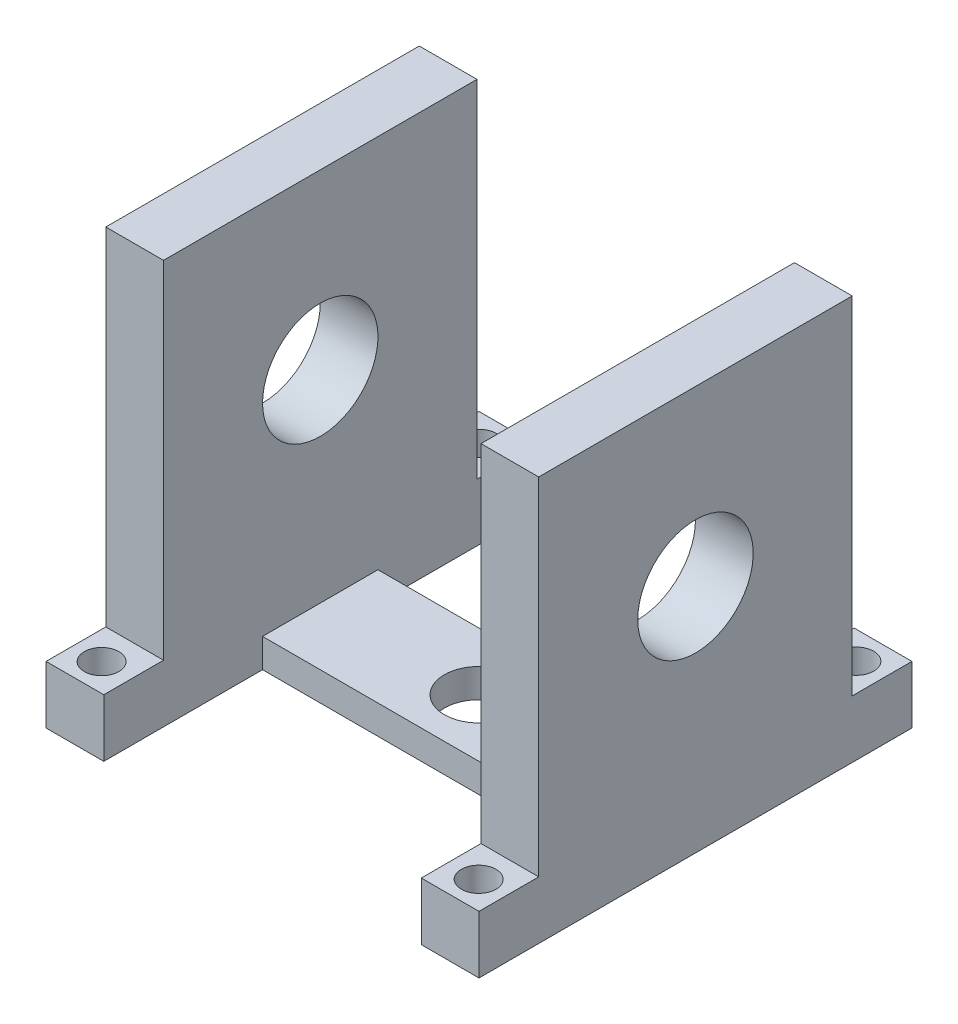
ISO-10303-21;
HEADER;
FILE_DESCRIPTION(('STEP AP214'),'2;1');
FILE_NAME('part.step','',(''),(''),'','','');
FILE_SCHEMA(('AUTOMOTIVE_DESIGN { 1 0 10303 214 1 1 1 1 }'));
ENDSEC;
DATA;
#1=APPLICATION_CONTEXT('core data for automotive mechanical design processes');
#2=APPLICATION_PROTOCOL_DEFINITION('international standard','automotive_design',2000,#1);
#3=PRODUCT_CONTEXT('',#1,'mechanical');
#4=PRODUCT('Part','Part','',(#3));
#5=PRODUCT_RELATED_PRODUCT_CATEGORY('part','',(#4));
#6=PRODUCT_DEFINITION_FORMATION('','',#4);
#7=PRODUCT_DEFINITION_CONTEXT('part definition',#1,'design');
#8=PRODUCT_DEFINITION('design','',#6,#7);
#9=PRODUCT_DEFINITION_SHAPE('','',#8);
#10=(LENGTH_UNIT() NAMED_UNIT(*) SI_UNIT(.MILLI.,.METRE.));
#11=(NAMED_UNIT(*) PLANE_ANGLE_UNIT() SI_UNIT($,.RADIAN.));
#12=(NAMED_UNIT(*) SI_UNIT($,.STERADIAN.) SOLID_ANGLE_UNIT());
#13=UNCERTAINTY_MEASURE_WITH_UNIT(LENGTH_MEASURE(1.E-05),#10,'distance_accuracy_value','');
#14=(GEOMETRIC_REPRESENTATION_CONTEXT(3) GLOBAL_UNCERTAINTY_ASSIGNED_CONTEXT((#13)) GLOBAL_UNIT_ASSIGNED_CONTEXT((#10,
#11,#12)) REPRESENTATION_CONTEXT('',''));
#15=CARTESIAN_POINT('',(0.,0.,0.));
#16=DIRECTION('',(0.,0.,1.));
#17=DIRECTION('',(1.,0.,0.));
#18=AXIS2_PLACEMENT_3D('',#15,#16,#17);
#19=CARTESIAN_POINT('',(0.,10.,0.));
#20=DIRECTION('',(0.,-1.,0.));
#21=DIRECTION('',(0.,0.,-1.));
#22=AXIS2_PLACEMENT_3D('',#19,#20,#21);
#23=PLANE('',#22);
#24=CARTESIAN_POINT('',(32.66,10.,32.72));
#25=DIRECTION('',(0.,1.,0.));
#26=DIRECTION('',(0.,0.,1.));
#27=AXIS2_PLACEMENT_3D('',#24,#25,#26);
#28=CIRCLE('',#27,3.);
#29=CARTESIAN_POINT('',(32.66,10.,35.72));
#30=VERTEX_POINT('',#29);
#31=EDGE_CURVE('E301',#30,#30,#28,.T.);
#32=ORIENTED_EDGE('',*,*,#31,.F.);
#33=EDGE_LOOP('',(#32));
#34=FACE_BOUND('',#33,.T.);
#35=DIRECTION('',(0.,0.,-1.));
#36=VECTOR('',#35,1.);
#37=CARTESIAN_POINT('',(27.4999999999999,10.,0.));
#38=LINE('',#37,#36);
#39=CARTESIAN_POINT('',(27.5,10.,37.5));
#40=VERTEX_POINT('',#39);
#41=CARTESIAN_POINT('',(27.5,10.,27.154127805021));
#42=VERTEX_POINT('',#41);
#43=EDGE_CURVE('E206',#40,#42,#38,.T.);
#44=ORIENTED_EDGE('',*,*,#43,.F.);
#45=DIRECTION('',(1.,0.,0.));
#46=VECTOR('',#45,1.);
#47=CARTESIAN_POINT('',(37.5,10.,37.5));
#48=LINE('',#47,#46);
#49=CARTESIAN_POINT('',(37.5,10.,37.5));
#50=VERTEX_POINT('',#49);
#51=EDGE_CURVE('E321',#40,#50,#48,.T.);
#52=ORIENTED_EDGE('',*,*,#51,.T.);
#53=DIRECTION('',(0.,0.,-1.));
#54=VECTOR('',#53,1.);
#55=CARTESIAN_POINT('',(37.5,10.,-37.5));
#56=LINE('',#55,#54);
#57=CARTESIAN_POINT('',(37.5,10.,27.154127805021));
#58=VERTEX_POINT('',#57);
#59=EDGE_CURVE('E327',#50,#58,#56,.T.);
#60=ORIENTED_EDGE('',*,*,#59,.T.);
#61=DIRECTION('',(1.,0.,0.));
#62=VECTOR('',#61,1.);
#63=CARTESIAN_POINT('',(37.5,10.,27.154127805021));
#64=LINE('',#63,#62);
#65=EDGE_CURVE('E243',#42,#58,#64,.T.);
#66=ORIENTED_EDGE('',*,*,#65,.F.);
#67=EDGE_LOOP('',(#44,#52,#60,#66));
#68=FACE_BOUND('',#67,.T.);
#69=ADVANCED_FACE('F39',(#34,#68),#23,.F.);
#70=CARTESIAN_POINT('',(-32.66,10.,32.72));
#71=DIRECTION('',(0.,1.,0.));
#72=DIRECTION('',(0.,0.,-1.));
#73=AXIS2_PLACEMENT_3D('',#70,#71,#72);
#74=CIRCLE('',#73,3.);
#75=CARTESIAN_POINT('',(-32.66,10.,29.72));
#76=VERTEX_POINT('',#75);
#77=EDGE_CURVE('E295',#76,#76,#74,.T.);
#78=ORIENTED_EDGE('',*,*,#77,.F.);
#79=EDGE_LOOP('',(#78));
#80=FACE_BOUND('',#79,.T.);
#81=CARTESIAN_POINT('',(-37.5,10.,37.5));
#82=VERTEX_POINT('',#81);
#83=CARTESIAN_POINT('',(-27.5,10.,37.5));
#84=VERTEX_POINT('',#83);
#85=EDGE_CURVE('E323',#82,#84,#48,.T.);
#86=ORIENTED_EDGE('',*,*,#85,.T.);
#87=DIRECTION('',(0.,0.,-1.));
#88=VECTOR('',#87,1.);
#89=CARTESIAN_POINT('',(-27.5,10.,0.));
#90=LINE('',#89,#88);
#91=CARTESIAN_POINT('',(-27.5,10.,27.154127805021));
#92=VERTEX_POINT('',#91);
#93=EDGE_CURVE('E63',#84,#92,#90,.T.);
#94=ORIENTED_EDGE('',*,*,#93,.T.);
#95=DIRECTION('',(1.,0.,0.));
#96=VECTOR('',#95,1.);
#97=CARTESIAN_POINT('',(-37.5,10.,27.154127805021));
#98=LINE('',#97,#96);
#99=CARTESIAN_POINT('',(-37.5,10.,27.154127805021));
#100=VERTEX_POINT('',#99);
#101=EDGE_CURVE('E265',#100,#92,#98,.T.);
#102=ORIENTED_EDGE('',*,*,#101,.F.);
#103=DIRECTION('',(0.,0.,1.));
#104=VECTOR('',#103,1.);
#105=CARTESIAN_POINT('',(-37.5,10.,-37.5));
#106=LINE('',#105,#104);
#107=EDGE_CURVE('E322',#100,#82,#106,.T.);
#108=ORIENTED_EDGE('',*,*,#107,.T.);
#109=EDGE_LOOP('',(#86,#94,#102,#108));
#110=FACE_BOUND('',#109,.T.);
#111=ADVANCED_FACE('F432',(#80,#110),#23,.F.);
#112=CARTESIAN_POINT('',(0.,0.,0.));
#113=DIRECTION('',(0.,-1.,0.));
#114=DIRECTION('',(0.,0.,-1.));
#115=AXIS2_PLACEMENT_3D('',#112,#113,#114);
#116=PLANE('',#115);
#117=CARTESIAN_POINT('',(-32.66,0.,32.72));
#118=DIRECTION('',(0.,1.,0.));
#119=DIRECTION('',(0.,0.,-1.));
#120=AXIS2_PLACEMENT_3D('',#117,#118,#119);
#121=CIRCLE('',#120,3.);
#122=CARTESIAN_POINT('',(-32.66,0.,29.72));
#123=VERTEX_POINT('',#122);
#124=EDGE_CURVE('E294',#123,#123,#121,.T.);
#125=ORIENTED_EDGE('',*,*,#124,.T.);
#126=EDGE_LOOP('',(#125));
#127=FACE_BOUND('',#126,.T.);
#128=CARTESIAN_POINT('',(32.66,0.,-32.72));
#129=DIRECTION('',(0.,1.,0.));
#130=DIRECTION('',(0.,0.,-1.));
#131=AXIS2_PLACEMENT_3D('',#128,#129,#130);
#132=CIRCLE('',#131,3.);
#133=CARTESIAN_POINT('',(32.66,0.,-35.72));
#134=VERTEX_POINT('',#133);
#135=EDGE_CURVE('E304',#134,#134,#132,.T.);
#136=ORIENTED_EDGE('',*,*,#135,.T.);
#137=EDGE_LOOP('',(#136));
#138=FACE_BOUND('',#137,.T.);
#139=CARTESIAN_POINT('',(-32.66,0.,-32.72));
#140=DIRECTION('',(0.,1.,0.));
#141=DIRECTION('',(0.,0.,1.));
#142=AXIS2_PLACEMENT_3D('',#139,#140,#141);
#143=CIRCLE('',#142,3.);
#144=CARTESIAN_POINT('',(-32.66,0.,-29.72));
#145=VERTEX_POINT('',#144);
#146=EDGE_CURVE('E310',#145,#145,#143,.T.);
#147=ORIENTED_EDGE('',*,*,#146,.T.);
#148=EDGE_LOOP('',(#147));
#149=FACE_BOUND('',#148,.T.);
#150=CARTESIAN_POINT('',(32.66,0.,32.72));
#151=DIRECTION('',(0.,1.,0.));
#152=DIRECTION('',(0.,0.,1.));
#153=AXIS2_PLACEMENT_3D('',#150,#151,#152);
#154=CIRCLE('',#153,3.);
#155=CARTESIAN_POINT('',(32.66,0.,35.72));
#156=VERTEX_POINT('',#155);
#157=EDGE_CURVE('E298',#156,#156,#154,.T.);
#158=ORIENTED_EDGE('',*,*,#157,.T.);
#159=EDGE_LOOP('',(#158));
#160=FACE_BOUND('',#159,.T.);
#161=CARTESIAN_POINT('',(0.,0.,0.));
#162=DIRECTION('',(0.,1.,0.));
#163=DIRECTION('',(0.,0.,1.));
#164=AXIS2_PLACEMENT_3D('',#161,#162,#163);
#165=CIRCLE('',#164,6.);
#166=CARTESIAN_POINT('',(0.,0.,6.));
#167=VERTEX_POINT('',#166);
#168=EDGE_CURVE('E291',#167,#167,#165,.T.);
#169=ORIENTED_EDGE('',*,*,#168,.T.);
#170=EDGE_LOOP('',(#169));
#171=FACE_BOUND('',#170,.T.);
#172=DIRECTION('',(1.,0.,0.));
#173=VECTOR('',#172,1.);
#174=CARTESIAN_POINT('',(37.5,0.,37.5));
#175=LINE('',#174,#173);
#176=CARTESIAN_POINT('',(27.5,0.,37.5));
#177=VERTEX_POINT('',#176);
#178=CARTESIAN_POINT('',(37.5,0.,37.5));
#179=VERTEX_POINT('',#178);
#180=EDGE_CURVE('E336',#177,#179,#175,.T.);
#181=ORIENTED_EDGE('',*,*,#180,.F.);
#182=DIRECTION('',(0.,0.,1.));
#183=VECTOR('',#182,1.);
#184=CARTESIAN_POINT('',(27.4999999999999,0.,0.));
#185=LINE('',#184,#183);
#186=CARTESIAN_POINT('',(27.5,0.,10.));
#187=VERTEX_POINT('',#186);
#188=EDGE_CURVE('E392',#187,#177,#185,.T.);
#189=ORIENTED_EDGE('',*,*,#188,.F.);
#190=DIRECTION('',(-1.,0.,0.));
#191=VECTOR('',#190,1.);
#192=CARTESIAN_POINT('',(0.,0.,10.));
#193=LINE('',#192,#191);
#194=CARTESIAN_POINT('',(-27.5,0.,10.));
#195=VERTEX_POINT('',#194);
#196=EDGE_CURVE('E194',#187,#195,#193,.T.);
#197=ORIENTED_EDGE('',*,*,#196,.T.);
#198=DIRECTION('',(0.,0.,1.));
#199=VECTOR('',#198,1.);
#200=CARTESIAN_POINT('',(-27.5,0.,0.));
#201=LINE('',#200,#199);
#202=CARTESIAN_POINT('',(-27.5,0.,37.5));
#203=VERTEX_POINT('',#202);
#204=EDGE_CURVE('E197',#195,#203,#201,.T.);
#205=ORIENTED_EDGE('',*,*,#204,.T.);
#206=CARTESIAN_POINT('',(-37.5,0.,37.5));
#207=VERTEX_POINT('',#206);
#208=EDGE_CURVE('E337',#207,#203,#175,.T.);
#209=ORIENTED_EDGE('',*,*,#208,.F.);
#210=DIRECTION('',(0.,0.,1.));
#211=VECTOR('',#210,1.);
#212=CARTESIAN_POINT('',(-37.5,0.,-37.5));
#213=LINE('',#212,#211);
#214=CARTESIAN_POINT('',(-37.5,0.,-37.5));
#215=VERTEX_POINT('',#214);
#216=EDGE_CURVE('E316',#215,#207,#213,.T.);
#217=ORIENTED_EDGE('',*,*,#216,.F.);
#218=DIRECTION('',(-1.,0.,0.));
#219=VECTOR('',#218,1.);
#220=CARTESIAN_POINT('',(37.5,0.,-37.5));
#221=LINE('',#220,#219);
#222=CARTESIAN_POINT('',(-27.5,0.,-37.5));
#223=VERTEX_POINT('',#222);
#224=EDGE_CURVE('E342',#223,#215,#221,.T.);
#225=ORIENTED_EDGE('',*,*,#224,.F.);
#226=DIRECTION('',(0.,0.,-1.));
#227=VECTOR('',#226,1.);
#228=CARTESIAN_POINT('',(-27.5,0.,0.));
#229=LINE('',#228,#227);
#230=CARTESIAN_POINT('',(-27.5,0.,-10.));
#231=VERTEX_POINT('',#230);
#232=EDGE_CURVE('E212',#231,#223,#229,.T.);
#233=ORIENTED_EDGE('',*,*,#232,.F.);
#234=DIRECTION('',(-1.,0.,0.));
#235=VECTOR('',#234,1.);
#236=CARTESIAN_POINT('',(0.,0.,-10.));
#237=LINE('',#236,#235);
#238=CARTESIAN_POINT('',(27.5,0.,-10.));
#239=VERTEX_POINT('',#238);
#240=EDGE_CURVE('E214',#239,#231,#237,.T.);
#241=ORIENTED_EDGE('',*,*,#240,.F.);
#242=DIRECTION('',(0.,0.,-1.));
#243=VECTOR('',#242,1.);
#244=CARTESIAN_POINT('',(27.5,0.,0.));
#245=LINE('',#244,#243);
#246=CARTESIAN_POINT('',(27.5,0.,-37.5));
#247=VERTEX_POINT('',#246);
#248=EDGE_CURVE('E209',#239,#247,#245,.T.);
#249=ORIENTED_EDGE('',*,*,#248,.T.);
#250=CARTESIAN_POINT('',(37.5,0.,-37.5));
#251=VERTEX_POINT('',#250);
#252=EDGE_CURVE('E343',#251,#247,#221,.T.);
#253=ORIENTED_EDGE('',*,*,#252,.F.);
#254=DIRECTION('',(0.,0.,-1.));
#255=VECTOR('',#254,1.);
#256=CARTESIAN_POINT('',(37.5,0.,-37.5));
#257=LINE('',#256,#255);
#258=EDGE_CURVE('E340',#179,#251,#257,.T.);
#259=ORIENTED_EDGE('',*,*,#258,.F.);
#260=EDGE_LOOP('',(#181,#189,#197,#205,#209,#217,#225,#233,#241,#249,#253,#259));
#261=FACE_BOUND('',#260,.T.);
#262=ADVANCED_FACE('F363',(#127,#138,#149,#160,#171,#261),#116,.T.);
#263=CARTESIAN_POINT('',(37.5,10.,37.5));
#264=DIRECTION('',(0.,0.,-1.));
#265=DIRECTION('',(-1.,0.,0.));
#266=AXIS2_PLACEMENT_3D('',#263,#264,#265);
#267=PLANE('',#266);
#268=DIRECTION('',(0.,1.,0.));
#269=VECTOR('',#268,1.);
#270=CARTESIAN_POINT('',(27.5,0.,37.5));
#271=LINE('',#270,#269);
#272=EDGE_CURVE('E207',#177,#40,#271,.T.);
#273=ORIENTED_EDGE('',*,*,#272,.F.);
#274=ORIENTED_EDGE('',*,*,#180,.T.);
#275=DIRECTION('',(0.,-1.,0.));
#276=VECTOR('',#275,1.);
#277=CARTESIAN_POINT('',(37.5,10.,37.5));
#278=LINE('',#277,#276);
#279=EDGE_CURVE('E48',#50,#179,#278,.T.);
#280=ORIENTED_EDGE('',*,*,#279,.F.);
#281=ORIENTED_EDGE('',*,*,#51,.F.);
#282=EDGE_LOOP('',(#273,#274,#280,#281));
#283=FACE_BOUND('',#282,.T.);
#284=ADVANCED_FACE('F388',(#283),#267,.F.);
#285=CARTESIAN_POINT('',(-32.66,10.,-32.72));
#286=DIRECTION('',(0.,1.,0.));
#287=DIRECTION('',(0.,0.,1.));
#288=AXIS2_PLACEMENT_3D('',#285,#286,#287);
#289=CIRCLE('',#288,3.);
#290=CARTESIAN_POINT('',(-32.66,10.,-29.72));
#291=VERTEX_POINT('',#290);
#292=EDGE_CURVE('E313',#291,#291,#289,.T.);
#293=ORIENTED_EDGE('',*,*,#292,.F.);
#294=EDGE_LOOP('',(#293));
#295=FACE_BOUND('',#294,.T.);
#296=DIRECTION('',(0.,0.,1.));
#297=VECTOR('',#296,1.);
#298=CARTESIAN_POINT('',(-27.5,10.,0.));
#299=LINE('',#298,#297);
#300=CARTESIAN_POINT('',(-27.5,10.,-37.5));
#301=VERTEX_POINT('',#300);
#302=CARTESIAN_POINT('',(-27.5,10.,-27.154127805021));
#303=VERTEX_POINT('',#302);
#304=EDGE_CURVE('E218',#301,#303,#299,.T.);
#305=ORIENTED_EDGE('',*,*,#304,.F.);
#306=DIRECTION('',(-1.,0.,0.));
#307=VECTOR('',#306,1.);
#308=CARTESIAN_POINT('',(37.5,10.,-37.5));
#309=LINE('',#308,#307);
#310=CARTESIAN_POINT('',(-37.5,10.,-37.5));
#311=VERTEX_POINT('',#310);
#312=EDGE_CURVE('E329',#301,#311,#309,.T.);
#313=ORIENTED_EDGE('',*,*,#312,.T.);
#314=CARTESIAN_POINT('',(-37.5,10.,-27.154127805021));
#315=VERTEX_POINT('',#314);
#316=EDGE_CURVE('E319',#311,#315,#106,.T.);
#317=ORIENTED_EDGE('',*,*,#316,.T.);
#318=DIRECTION('',(-1.,0.,0.));
#319=VECTOR('',#318,1.);
#320=CARTESIAN_POINT('',(-37.5,10.,-27.154127805021));
#321=LINE('',#320,#319);
#322=EDGE_CURVE('E270',#303,#315,#321,.T.);
#323=ORIENTED_EDGE('',*,*,#322,.F.);
#324=EDGE_LOOP('',(#305,#313,#317,#323));
#325=FACE_BOUND('',#324,.T.);
#326=ADVANCED_FACE('F419',(#295,#325),#23,.F.);
#327=CARTESIAN_POINT('',(37.5,10.,-37.5));
#328=DIRECTION('',(0.,0.,1.));
#329=DIRECTION('',(1.,0.,0.));
#330=AXIS2_PLACEMENT_3D('',#327,#328,#329);
#331=PLANE('',#330);
#332=DIRECTION('',(0.,1.,0.));
#333=VECTOR('',#332,1.);
#334=CARTESIAN_POINT('',(-27.5,0.,-37.5));
#335=LINE('',#334,#333);
#336=EDGE_CURVE('E222',#223,#301,#335,.T.);
#337=ORIENTED_EDGE('',*,*,#336,.F.);
#338=ORIENTED_EDGE('',*,*,#224,.T.);
#339=DIRECTION('',(0.,-1.,0.));
#340=VECTOR('',#339,1.);
#341=CARTESIAN_POINT('',(-37.5,10.,-37.5));
#342=LINE('',#341,#340);
#343=EDGE_CURVE('E333',#311,#215,#342,.T.);
#344=ORIENTED_EDGE('',*,*,#343,.F.);
#345=ORIENTED_EDGE('',*,*,#312,.F.);
#346=EDGE_LOOP('',(#337,#338,#344,#345));
#347=FACE_BOUND('',#346,.T.);
#348=ADVANCED_FACE('F409',(#347),#331,.F.);
#349=CARTESIAN_POINT('',(32.66,10.,-32.72));
#350=DIRECTION('',(0.,1.,0.));
#351=DIRECTION('',(0.,0.,-1.));
#352=AXIS2_PLACEMENT_3D('',#349,#350,#351);
#353=CIRCLE('',#352,3.);
#354=CARTESIAN_POINT('',(32.66,10.,-35.72));
#355=VERTEX_POINT('',#354);
#356=EDGE_CURVE('E307',#355,#355,#353,.T.);
#357=ORIENTED_EDGE('',*,*,#356,.F.);
#358=EDGE_LOOP('',(#357));
#359=FACE_BOUND('',#358,.T.);
#360=CARTESIAN_POINT('',(37.5,10.,-37.5));
#361=VERTEX_POINT('',#360);
#362=CARTESIAN_POINT('',(27.5,10.,-37.5));
#363=VERTEX_POINT('',#362);
#364=EDGE_CURVE('E330',#361,#363,#309,.T.);
#365=ORIENTED_EDGE('',*,*,#364,.T.);
#366=DIRECTION('',(0.,0.,1.));
#367=VECTOR('',#366,1.);
#368=CARTESIAN_POINT('',(27.5,10.,0.));
#369=LINE('',#368,#367);
#370=CARTESIAN_POINT('',(27.5,10.,-27.154127805021));
#371=VERTEX_POINT('',#370);
#372=EDGE_CURVE('E227',#363,#371,#369,.T.);
#373=ORIENTED_EDGE('',*,*,#372,.T.);
#374=DIRECTION('',(-1.,0.,0.));
#375=VECTOR('',#374,1.);
#376=CARTESIAN_POINT('',(37.5,10.,-27.154127805021));
#377=LINE('',#376,#375);
#378=CARTESIAN_POINT('',(37.5,10.,-27.154127805021));
#379=VERTEX_POINT('',#378);
#380=EDGE_CURVE('E238',#379,#371,#377,.T.);
#381=ORIENTED_EDGE('',*,*,#380,.F.);
#382=EDGE_CURVE('E326',#379,#361,#56,.T.);
#383=ORIENTED_EDGE('',*,*,#382,.T.);
#384=EDGE_LOOP('',(#365,#373,#381,#383));
#385=FACE_BOUND('',#384,.T.);
#386=ADVANCED_FACE('F372',(#359,#385),#23,.F.);
#387=CARTESIAN_POINT('',(-37.5,10.,-37.5));
#388=DIRECTION('',(1.,0.,0.));
#389=DIRECTION('',(0.,0.,-1.));
#390=AXIS2_PLACEMENT_3D('',#387,#388,#389);
#391=PLANE('',#390);
#392=CARTESIAN_POINT('',(-37.5,40.,0.));
#393=DIRECTION('',(1.,0.,0.));
#394=DIRECTION('',(0.,0.,-1.));
#395=AXIS2_PLACEMENT_3D('',#392,#393,#394);
#396=CIRCLE('',#395,10.);
#397=CARTESIAN_POINT('',(-37.5,40.,-10.));
#398=VERTEX_POINT('',#397);
#399=EDGE_CURVE('E235',#398,#398,#396,.T.);
#400=ORIENTED_EDGE('',*,*,#399,.T.);
#401=EDGE_LOOP('',(#400));
#402=FACE_BOUND('',#401,.T.);
#403=ORIENTED_EDGE('',*,*,#216,.T.);
#404=DIRECTION('',(0.,-1.,0.));
#405=VECTOR('',#404,1.);
#406=CARTESIAN_POINT('',(-37.5,10.,37.5));
#407=LINE('',#406,#405);
#408=EDGE_CURVE('E11',#82,#207,#407,.T.);
#409=ORIENTED_EDGE('',*,*,#408,.F.);
#410=ORIENTED_EDGE('',*,*,#107,.F.);
#411=DIRECTION('',(0.,-1.,0.));
#412=VECTOR('',#411,1.);
#413=CARTESIAN_POINT('',(-37.5,70.,27.154127805021));
#414=LINE('',#413,#412);
#415=CARTESIAN_POINT('',(-37.5,70.,27.154127805021));
#416=VERTEX_POINT('',#415);
#417=EDGE_CURVE('E288',#416,#100,#414,.T.);
#418=ORIENTED_EDGE('',*,*,#417,.F.);
#419=DIRECTION('',(0.,0.,1.));
#420=VECTOR('',#419,1.);
#421=CARTESIAN_POINT('',(-37.5,70.,-27.154127805021));
#422=LINE('',#421,#420);
#423=CARTESIAN_POINT('',(-37.5,70.,-27.154127805021));
#424=VERTEX_POINT('',#423);
#425=EDGE_CURVE('E266',#424,#416,#422,.T.);
#426=ORIENTED_EDGE('',*,*,#425,.F.);
#427=DIRECTION('',(0.,-1.,0.));
#428=VECTOR('',#427,1.);
#429=CARTESIAN_POINT('',(-37.5,70.,-27.154127805021));
#430=LINE('',#429,#428);
#431=EDGE_CURVE('E276',#424,#315,#430,.T.);
#432=ORIENTED_EDGE('',*,*,#431,.T.);
#433=ORIENTED_EDGE('',*,*,#316,.F.);
#434=ORIENTED_EDGE('',*,*,#343,.T.);
#435=EDGE_LOOP('',(#403,#409,#410,#418,#426,#432,#433,#434));
#436=FACE_BOUND('',#435,.T.);
#437=ADVANCED_FACE('F41',(#402,#436),#391,.F.);
#438=ORIENTED_EDGE('',*,*,#208,.T.);
#439=DIRECTION('',(0.,1.,0.));
#440=VECTOR('',#439,1.);
#441=CARTESIAN_POINT('',(-27.5,0.,37.5));
#442=LINE('',#441,#440);
#443=EDGE_CURVE('E199',#203,#84,#442,.T.);
#444=ORIENTED_EDGE('',*,*,#443,.T.);
#445=ORIENTED_EDGE('',*,*,#85,.F.);
#446=ORIENTED_EDGE('',*,*,#408,.T.);
#447=EDGE_LOOP('',(#438,#444,#445,#446));
#448=FACE_BOUND('',#447,.T.);
#449=ADVANCED_FACE('F435',(#448),#267,.F.);
#450=CARTESIAN_POINT('',(37.5,10.,-37.5));
#451=DIRECTION('',(-1.,0.,0.));
#452=DIRECTION('',(0.,0.,1.));
#453=AXIS2_PLACEMENT_3D('',#450,#451,#452);
#454=PLANE('',#453);
#455=CARTESIAN_POINT('',(37.5,40.,0.));
#456=DIRECTION('',(-1.,0.,0.));
#457=DIRECTION('',(0.,0.,1.));
#458=AXIS2_PLACEMENT_3D('',#455,#456,#457);
#459=CIRCLE('',#458,10.);
#460=CARTESIAN_POINT('',(37.5,40.,10.));
#461=VERTEX_POINT('',#460);
#462=EDGE_CURVE('E229',#461,#461,#459,.T.);
#463=ORIENTED_EDGE('',*,*,#462,.T.);
#464=EDGE_LOOP('',(#463));
#465=FACE_BOUND('',#464,.T.);
#466=ORIENTED_EDGE('',*,*,#258,.T.);
#467=DIRECTION('',(0.,-1.,0.));
#468=VECTOR('',#467,1.);
#469=CARTESIAN_POINT('',(37.5,10.,-37.5));
#470=LINE('',#469,#468);
#471=EDGE_CURVE('E348',#361,#251,#470,.T.);
#472=ORIENTED_EDGE('',*,*,#471,.F.);
#473=ORIENTED_EDGE('',*,*,#382,.F.);
#474=DIRECTION('',(0.,-1.,0.));
#475=VECTOR('',#474,1.);
#476=CARTESIAN_POINT('',(37.5,70.,-27.154127805021));
#477=LINE('',#476,#475);
#478=CARTESIAN_POINT('',(37.5,70.,-27.154127805021));
#479=VERTEX_POINT('',#478);
#480=EDGE_CURVE('E262',#479,#379,#477,.T.);
#481=ORIENTED_EDGE('',*,*,#480,.F.);
#482=DIRECTION('',(0.,0.,-1.));
#483=VECTOR('',#482,1.);
#484=CARTESIAN_POINT('',(37.5,70.,-27.154127805021));
#485=LINE('',#484,#483);
#486=CARTESIAN_POINT('',(37.5,70.,27.154127805021));
#487=VERTEX_POINT('',#486);
#488=EDGE_CURVE('E239',#487,#479,#485,.T.);
#489=ORIENTED_EDGE('',*,*,#488,.F.);
#490=DIRECTION('',(0.,-1.,0.));
#491=VECTOR('',#490,1.);
#492=CARTESIAN_POINT('',(37.5,70.,27.154127805021));
#493=LINE('',#492,#491);
#494=EDGE_CURVE('E249',#487,#58,#493,.T.);
#495=ORIENTED_EDGE('',*,*,#494,.T.);
#496=ORIENTED_EDGE('',*,*,#59,.F.);
#497=ORIENTED_EDGE('',*,*,#279,.T.);
#498=EDGE_LOOP('',(#466,#472,#473,#481,#489,#495,#496,#497));
#499=FACE_BOUND('',#498,.T.);
#500=ADVANCED_FACE('F356',(#465,#499),#454,.F.);
#501=ORIENTED_EDGE('',*,*,#252,.T.);
#502=DIRECTION('',(0.,1.,0.));
#503=VECTOR('',#502,1.);
#504=CARTESIAN_POINT('',(27.5,0.,-37.5));
#505=LINE('',#504,#503);
#506=EDGE_CURVE('E216',#247,#363,#505,.T.);
#507=ORIENTED_EDGE('',*,*,#506,.T.);
#508=ORIENTED_EDGE('',*,*,#364,.F.);
#509=ORIENTED_EDGE('',*,*,#471,.T.);
#510=EDGE_LOOP('',(#501,#507,#508,#509));
#511=FACE_BOUND('',#510,.T.);
#512=ADVANCED_FACE('F366',(#511),#331,.F.);
#513=CARTESIAN_POINT('',(-32.66,10.,-32.72));
#514=DIRECTION('',(0.,-1.,0.));
#515=DIRECTION('',(0.,0.,-1.));
#516=AXIS2_PLACEMENT_3D('',#513,#514,#515);
#517=CYLINDRICAL_SURFACE('',#516,3.);
#518=ORIENTED_EDGE('',*,*,#292,.T.);
#519=EDGE_LOOP('',(#518));
#520=FACE_BOUND('',#519,.T.);
#521=ORIENTED_EDGE('',*,*,#146,.F.);
#522=EDGE_LOOP('',(#521));
#523=FACE_BOUND('',#522,.T.);
#524=ADVANCED_FACE('F469',(#520,#523),#517,.F.);
#525=CARTESIAN_POINT('',(32.66,10.,-32.72));
#526=DIRECTION('',(0.,-1.,0.));
#527=DIRECTION('',(0.,0.,-1.));
#528=AXIS2_PLACEMENT_3D('',#525,#526,#527);
#529=CYLINDRICAL_SURFACE('',#528,3.);
#530=ORIENTED_EDGE('',*,*,#356,.T.);
#531=EDGE_LOOP('',(#530));
#532=FACE_BOUND('',#531,.T.);
#533=ORIENTED_EDGE('',*,*,#135,.F.);
#534=EDGE_LOOP('',(#533));
#535=FACE_BOUND('',#534,.T.);
#536=ADVANCED_FACE('F472',(#532,#535),#529,.F.);
#537=CARTESIAN_POINT('',(32.66,10.,32.72));
#538=DIRECTION('',(0.,-1.,0.));
#539=DIRECTION('',(0.,0.,-1.));
#540=AXIS2_PLACEMENT_3D('',#537,#538,#539);
#541=CYLINDRICAL_SURFACE('',#540,3.);
#542=ORIENTED_EDGE('',*,*,#31,.T.);
#543=EDGE_LOOP('',(#542));
#544=FACE_BOUND('',#543,.T.);
#545=ORIENTED_EDGE('',*,*,#157,.F.);
#546=EDGE_LOOP('',(#545));
#547=FACE_BOUND('',#546,.T.);
#548=ADVANCED_FACE('F492',(#544,#547),#541,.F.);
#549=CARTESIAN_POINT('',(-32.66,10.,32.72));
#550=DIRECTION('',(0.,-1.,0.));
#551=DIRECTION('',(0.,0.,-1.));
#552=AXIS2_PLACEMENT_3D('',#549,#550,#551);
#553=CYLINDRICAL_SURFACE('',#552,3.);
#554=ORIENTED_EDGE('',*,*,#77,.T.);
#555=EDGE_LOOP('',(#554));
#556=FACE_BOUND('',#555,.T.);
#557=ORIENTED_EDGE('',*,*,#124,.F.);
#558=EDGE_LOOP('',(#557));
#559=FACE_BOUND('',#558,.T.);
#560=ADVANCED_FACE('F484',(#556,#559),#553,.F.);
#561=CARTESIAN_POINT('',(0.,10.,0.));
#562=DIRECTION('',(0.,-1.,0.));
#563=DIRECTION('',(0.,0.,-1.));
#564=AXIS2_PLACEMENT_3D('',#561,#562,#563);
#565=CYLINDRICAL_SURFACE('',#564,6.);
#566=CARTESIAN_POINT('',(0.,5.,0.));
#567=DIRECTION('',(0.,-1.,0.));
#568=DIRECTION('',(0.,0.,-1.));
#569=AXIS2_PLACEMENT_3D('',#566,#567,#568);
#570=CIRCLE('',#569,6.);
#571=CARTESIAN_POINT('',(0.,5.,-6.));
#572=VERTEX_POINT('',#571);
#573=EDGE_CURVE('E394',#572,#572,#570,.T.);
#574=ORIENTED_EDGE('',*,*,#573,.F.);
#575=EDGE_LOOP('',(#574));
#576=FACE_BOUND('',#575,.T.);
#577=ORIENTED_EDGE('',*,*,#168,.F.);
#578=EDGE_LOOP('',(#577));
#579=FACE_BOUND('',#578,.T.);
#580=ADVANCED_FACE('F482',(#576,#579),#565,.F.);
#581=CARTESIAN_POINT('',(-37.5,70.,27.154127805021));
#582=DIRECTION('',(0.,0.,-1.));
#583=DIRECTION('',(-1.,0.,0.));
#584=AXIS2_PLACEMENT_3D('',#581,#582,#583);
#585=PLANE('',#584);
#586=ORIENTED_EDGE('',*,*,#101,.T.);
#587=DIRECTION('',(0.,-1.,0.));
#588=VECTOR('',#587,1.);
#589=CARTESIAN_POINT('',(-27.5,70.,27.154127805021));
#590=LINE('',#589,#588);
#591=CARTESIAN_POINT('',(-27.5,70.,27.154127805021));
#592=VERTEX_POINT('',#591);
#593=EDGE_CURVE('E286',#592,#92,#590,.T.);
#594=ORIENTED_EDGE('',*,*,#593,.F.);
#595=DIRECTION('',(1.,0.,0.));
#596=VECTOR('',#595,1.);
#597=CARTESIAN_POINT('',(-37.5,70.,27.154127805021));
#598=LINE('',#597,#596);
#599=EDGE_CURVE('E269',#416,#592,#598,.T.);
#600=ORIENTED_EDGE('',*,*,#599,.F.);
#601=ORIENTED_EDGE('',*,*,#417,.T.);
#602=EDGE_LOOP('',(#586,#594,#600,#601));
#603=FACE_BOUND('',#602,.T.);
#604=ADVANCED_FACE('F429',(#603),#585,.F.);
#605=CARTESIAN_POINT('',(-27.5,70.,-27.154127805021));
#606=DIRECTION('',(-1.,0.,0.));
#607=DIRECTION('',(0.,0.,1.));
#608=AXIS2_PLACEMENT_3D('',#605,#606,#607);
#609=PLANE('',#608);
#610=CARTESIAN_POINT('',(-27.5,40.,0.));
#611=DIRECTION('',(-1.,0.,0.));
#612=DIRECTION('',(0.,0.,1.));
#613=AXIS2_PLACEMENT_3D('',#610,#611,#612);
#614=CIRCLE('',#613,10.);
#615=CARTESIAN_POINT('',(-27.5,40.,10.));
#616=VERTEX_POINT('',#615);
#617=EDGE_CURVE('E232',#616,#616,#614,.T.);
#618=ORIENTED_EDGE('',*,*,#617,.T.);
#619=EDGE_LOOP('',(#618));
#620=FACE_BOUND('',#619,.T.);
#621=DIRECTION('',(0.,-1.,0.));
#622=VECTOR('',#621,1.);
#623=CARTESIAN_POINT('',(-27.5,70.,-27.154127805021));
#624=LINE('',#623,#622);
#625=CARTESIAN_POINT('',(-27.5,70.,-27.154127805021));
#626=VERTEX_POINT('',#625);
#627=EDGE_CURVE('E283',#626,#303,#624,.T.);
#628=ORIENTED_EDGE('',*,*,#627,.F.);
#629=DIRECTION('',(0.,0.,-1.));
#630=VECTOR('',#629,1.);
#631=CARTESIAN_POINT('',(-27.5,70.,-27.154127805021));
#632=LINE('',#631,#630);
#633=EDGE_CURVE('E272',#592,#626,#632,.T.);
#634=ORIENTED_EDGE('',*,*,#633,.F.);
#635=ORIENTED_EDGE('',*,*,#593,.T.);
#636=ORIENTED_EDGE('',*,*,#93,.F.);
#637=ORIENTED_EDGE('',*,*,#443,.F.);
#638=ORIENTED_EDGE('',*,*,#204,.F.);
#639=DIRECTION('',(0.,1.,0.));
#640=VECTOR('',#639,1.);
#641=CARTESIAN_POINT('',(-27.5,0.,10.));
#642=LINE('',#641,#640);
#643=CARTESIAN_POINT('',(-27.5,5.,10.));
#644=VERTEX_POINT('',#643);
#645=EDGE_CURVE('E196',#195,#644,#642,.T.);
#646=ORIENTED_EDGE('',*,*,#645,.T.);
#647=DIRECTION('',(0.,0.,1.));
#648=VECTOR('',#647,1.);
#649=CARTESIAN_POINT('',(-27.5,5.,-10.));
#650=LINE('',#649,#648);
#651=CARTESIAN_POINT('',(-27.5,5.,-10.));
#652=VERTEX_POINT('',#651);
#653=EDGE_CURVE('E55',#652,#644,#650,.T.);
#654=ORIENTED_EDGE('',*,*,#653,.F.);
#655=DIRECTION('',(0.,1.,0.));
#656=VECTOR('',#655,1.);
#657=CARTESIAN_POINT('',(-27.5,0.,-10.));
#658=LINE('',#657,#656);
#659=EDGE_CURVE('E219',#231,#652,#658,.T.);
#660=ORIENTED_EDGE('',*,*,#659,.F.);
#661=ORIENTED_EDGE('',*,*,#232,.T.);
#662=ORIENTED_EDGE('',*,*,#336,.T.);
#663=ORIENTED_EDGE('',*,*,#304,.T.);
#664=EDGE_LOOP('',(#628,#634,#635,#636,#637,#638,#646,#654,#660,#661,#662,#663));
#665=FACE_BOUND('',#664,.T.);
#666=ADVANCED_FACE('F403',(#620,#665),#609,.F.);
#667=CARTESIAN_POINT('',(-37.5,70.,-27.154127805021));
#668=DIRECTION('',(0.,0.,1.));
#669=DIRECTION('',(1.,0.,0.));
#670=AXIS2_PLACEMENT_3D('',#667,#668,#669);
#671=PLANE('',#670);
#672=ORIENTED_EDGE('',*,*,#322,.T.);
#673=ORIENTED_EDGE('',*,*,#431,.F.);
#674=DIRECTION('',(-1.,0.,0.));
#675=VECTOR('',#674,1.);
#676=CARTESIAN_POINT('',(-37.5,70.,-27.154127805021));
#677=LINE('',#676,#675);
#678=EDGE_CURVE('E274',#626,#424,#677,.T.);
#679=ORIENTED_EDGE('',*,*,#678,.F.);
#680=ORIENTED_EDGE('',*,*,#627,.T.);
#681=EDGE_LOOP('',(#672,#673,#679,#680));
#682=FACE_BOUND('',#681,.T.);
#683=ADVANCED_FACE('F421',(#682),#671,.F.);
#684=CARTESIAN_POINT('',(0.,70.,0.));
#685=DIRECTION('',(0.,1.,0.));
#686=DIRECTION('',(0.,0.,1.));
#687=AXIS2_PLACEMENT_3D('',#684,#685,#686);
#688=PLANE('',#687);
#689=ORIENTED_EDGE('',*,*,#425,.T.);
#690=ORIENTED_EDGE('',*,*,#599,.T.);
#691=ORIENTED_EDGE('',*,*,#633,.T.);
#692=ORIENTED_EDGE('',*,*,#678,.T.);
#693=EDGE_LOOP('',(#689,#690,#691,#692));
#694=FACE_BOUND('',#693,.T.);
#695=ADVANCED_FACE('F426',(#694),#688,.T.);
#696=CARTESIAN_POINT('',(37.5,70.,-27.154127805021));
#697=DIRECTION('',(0.,0.,1.));
#698=DIRECTION('',(1.,0.,0.));
#699=AXIS2_PLACEMENT_3D('',#696,#697,#698);
#700=PLANE('',#699);
#701=ORIENTED_EDGE('',*,*,#380,.T.);
#702=DIRECTION('',(0.,-1.,0.));
#703=VECTOR('',#702,1.);
#704=CARTESIAN_POINT('',(27.5,70.,-27.154127805021));
#705=LINE('',#704,#703);
#706=CARTESIAN_POINT('',(27.5,70.,-27.154127805021));
#707=VERTEX_POINT('',#706);
#708=EDGE_CURVE('E259',#707,#371,#705,.T.);
#709=ORIENTED_EDGE('',*,*,#708,.F.);
#710=DIRECTION('',(-1.,0.,0.));
#711=VECTOR('',#710,1.);
#712=CARTESIAN_POINT('',(37.5,70.,-27.154127805021));
#713=LINE('',#712,#711);
#714=EDGE_CURVE('E242',#479,#707,#713,.T.);
#715=ORIENTED_EDGE('',*,*,#714,.F.);
#716=ORIENTED_EDGE('',*,*,#480,.T.);
#717=EDGE_LOOP('',(#701,#709,#715,#716));
#718=FACE_BOUND('',#717,.T.);
#719=ADVANCED_FACE('F375',(#718),#700,.F.);
#720=CARTESIAN_POINT('',(27.5,70.,-27.154127805021));
#721=DIRECTION('',(1.,0.,0.));
#722=DIRECTION('',(0.,0.,-1.));
#723=AXIS2_PLACEMENT_3D('',#720,#721,#722);
#724=PLANE('',#723);
#725=CARTESIAN_POINT('',(27.5,40.,0.));
#726=DIRECTION('',(1.,0.,0.));
#727=DIRECTION('',(0.,0.,-1.));
#728=AXIS2_PLACEMENT_3D('',#725,#726,#727);
#729=CIRCLE('',#728,10.);
#730=CARTESIAN_POINT('',(27.5,40.,-10.));
#731=VERTEX_POINT('',#730);
#732=EDGE_CURVE('E43',#731,#731,#729,.T.);
#733=ORIENTED_EDGE('',*,*,#732,.T.);
#734=EDGE_LOOP('',(#733));
#735=FACE_BOUND('',#734,.T.);
#736=DIRECTION('',(0.,1.,0.));
#737=VECTOR('',#736,1.);
#738=CARTESIAN_POINT('',(27.5,0.,-10.));
#739=LINE('',#738,#737);
#740=CARTESIAN_POINT('',(27.5,5.,-10.));
#741=VERTEX_POINT('',#740);
#742=EDGE_CURVE('E183',#239,#741,#739,.T.);
#743=ORIENTED_EDGE('',*,*,#742,.T.);
#744=DIRECTION('',(0.,0.,-1.));
#745=VECTOR('',#744,1.);
#746=CARTESIAN_POINT('',(27.5,5.,-10.));
#747=LINE('',#746,#745);
#748=CARTESIAN_POINT('',(27.5,5.,10.));
#749=VERTEX_POINT('',#748);
#750=EDGE_CURVE('E177',#749,#741,#747,.T.);
#751=ORIENTED_EDGE('',*,*,#750,.F.);
#752=DIRECTION('',(0.,1.,0.));
#753=VECTOR('',#752,1.);
#754=CARTESIAN_POINT('',(27.5,0.,10.));
#755=LINE('',#754,#753);
#756=EDGE_CURVE('E180',#187,#749,#755,.T.);
#757=ORIENTED_EDGE('',*,*,#756,.F.);
#758=ORIENTED_EDGE('',*,*,#188,.T.);
#759=ORIENTED_EDGE('',*,*,#272,.T.);
#760=ORIENTED_EDGE('',*,*,#43,.T.);
#761=DIRECTION('',(0.,-1.,0.));
#762=VECTOR('',#761,1.);
#763=CARTESIAN_POINT('',(27.5,70.,27.154127805021));
#764=LINE('',#763,#762);
#765=CARTESIAN_POINT('',(27.5,70.,27.154127805021));
#766=VERTEX_POINT('',#765);
#767=EDGE_CURVE('E256',#766,#42,#764,.T.);
#768=ORIENTED_EDGE('',*,*,#767,.F.);
#769=DIRECTION('',(0.,0.,1.));
#770=VECTOR('',#769,1.);
#771=CARTESIAN_POINT('',(27.5,70.,-27.154127805021));
#772=LINE('',#771,#770);
#773=EDGE_CURVE('E245',#707,#766,#772,.T.);
#774=ORIENTED_EDGE('',*,*,#773,.F.);
#775=ORIENTED_EDGE('',*,*,#708,.T.);
#776=ORIENTED_EDGE('',*,*,#372,.F.);
#777=ORIENTED_EDGE('',*,*,#506,.F.);
#778=ORIENTED_EDGE('',*,*,#248,.F.);
#779=EDGE_LOOP('',(#743,#751,#757,#758,#759,#760,#768,#774,#775,#776,#777,#778));
#780=FACE_BOUND('',#779,.T.);
#781=ADVANCED_FACE('F178',(#735,#780),#724,.F.);
#782=CARTESIAN_POINT('',(37.5,70.,27.154127805021));
#783=DIRECTION('',(0.,0.,-1.));
#784=DIRECTION('',(-1.,0.,0.));
#785=AXIS2_PLACEMENT_3D('',#782,#783,#784);
#786=PLANE('',#785);
#787=ORIENTED_EDGE('',*,*,#65,.T.);
#788=ORIENTED_EDGE('',*,*,#494,.F.);
#789=DIRECTION('',(1.,0.,0.));
#790=VECTOR('',#789,1.);
#791=CARTESIAN_POINT('',(37.5,70.,27.154127805021));
#792=LINE('',#791,#790);
#793=EDGE_CURVE('E247',#766,#487,#792,.T.);
#794=ORIENTED_EDGE('',*,*,#793,.F.);
#795=ORIENTED_EDGE('',*,*,#767,.T.);
#796=EDGE_LOOP('',(#787,#788,#794,#795));
#797=FACE_BOUND('',#796,.T.);
#798=ADVANCED_FACE('F382',(#797),#786,.F.);
#799=CARTESIAN_POINT('',(0.,70.,0.));
#800=DIRECTION('',(0.,-1.,0.));
#801=DIRECTION('',(0.,0.,-1.));
#802=AXIS2_PLACEMENT_3D('',#799,#800,#801);
#803=PLANE('',#802);
#804=ORIENTED_EDGE('',*,*,#488,.T.);
#805=ORIENTED_EDGE('',*,*,#714,.T.);
#806=ORIENTED_EDGE('',*,*,#773,.T.);
#807=ORIENTED_EDGE('',*,*,#793,.T.);
#808=EDGE_LOOP('',(#804,#805,#806,#807));
#809=FACE_BOUND('',#808,.T.);
#810=ADVANCED_FACE('F378',(#809),#803,.F.);
#811=CARTESIAN_POINT('',(37.5,40.,0.));
#812=DIRECTION('',(-1.,0.,0.));
#813=DIRECTION('',(0.,0.,1.));
#814=AXIS2_PLACEMENT_3D('',#811,#812,#813);
#815=CYLINDRICAL_SURFACE('',#814,10.);
#816=ORIENTED_EDGE('',*,*,#462,.F.);
#817=EDGE_LOOP('',(#816));
#818=FACE_BOUND('',#817,.T.);
#819=ORIENTED_EDGE('',*,*,#732,.F.);
#820=EDGE_LOOP('',(#819));
#821=FACE_BOUND('',#820,.T.);
#822=ADVANCED_FACE('F634',(#818,#821),#815,.F.);
#823=ORIENTED_EDGE('',*,*,#617,.F.);
#824=EDGE_LOOP('',(#823));
#825=FACE_BOUND('',#824,.T.);
#826=ORIENTED_EDGE('',*,*,#399,.F.);
#827=EDGE_LOOP('',(#826));
#828=FACE_BOUND('',#827,.T.);
#829=ADVANCED_FACE('F643',(#825,#828),#815,.F.);
#830=CARTESIAN_POINT('',(0.,0.,-10.));
#831=DIRECTION('',(0.,0.,-1.));
#832=DIRECTION('',(-1.,0.,0.));
#833=AXIS2_PLACEMENT_3D('',#830,#831,#832);
#834=PLANE('',#833);
#835=DIRECTION('',(-1.,0.,0.));
#836=VECTOR('',#835,1.);
#837=CARTESIAN_POINT('',(27.5,5.,-10.));
#838=LINE('',#837,#836);
#839=EDGE_CURVE('E185',#741,#652,#838,.T.);
#840=ORIENTED_EDGE('',*,*,#839,.F.);
#841=ORIENTED_EDGE('',*,*,#742,.F.);
#842=ORIENTED_EDGE('',*,*,#240,.T.);
#843=ORIENTED_EDGE('',*,*,#659,.T.);
#844=EDGE_LOOP('',(#840,#841,#842,#843));
#845=FACE_BOUND('',#844,.T.);
#846=ADVANCED_FACE('F400',(#845),#834,.T.);
#847=CARTESIAN_POINT('',(0.,0.,10.));
#848=DIRECTION('',(0.,0.,-1.));
#849=DIRECTION('',(-1.,0.,0.));
#850=AXIS2_PLACEMENT_3D('',#847,#848,#849);
#851=PLANE('',#850);
#852=ORIENTED_EDGE('',*,*,#756,.T.);
#853=DIRECTION('',(1.,0.,0.));
#854=VECTOR('',#853,1.);
#855=CARTESIAN_POINT('',(27.5,5.,10.));
#856=LINE('',#855,#854);
#857=EDGE_CURVE('E186',#644,#749,#856,.T.);
#858=ORIENTED_EDGE('',*,*,#857,.F.);
#859=ORIENTED_EDGE('',*,*,#645,.F.);
#860=ORIENTED_EDGE('',*,*,#196,.F.);
#861=EDGE_LOOP('',(#852,#858,#859,#860));
#862=FACE_BOUND('',#861,.T.);
#863=ADVANCED_FACE('F192',(#862),#851,.F.);
#864=CARTESIAN_POINT('',(0.,5.,0.));
#865=DIRECTION('',(0.,-1.,0.));
#866=DIRECTION('',(0.,0.,-1.));
#867=AXIS2_PLACEMENT_3D('',#864,#865,#866);
#868=PLANE('',#867);
#869=ORIENTED_EDGE('',*,*,#573,.T.);
#870=EDGE_LOOP('',(#869));
#871=FACE_BOUND('',#870,.T.);
#872=ORIENTED_EDGE('',*,*,#653,.T.);
#873=ORIENTED_EDGE('',*,*,#857,.T.);
#874=ORIENTED_EDGE('',*,*,#750,.T.);
#875=ORIENTED_EDGE('',*,*,#839,.T.);
#876=EDGE_LOOP('',(#872,#873,#874,#875));
#877=FACE_BOUND('',#876,.T.);
#878=ADVANCED_FACE('F188',(#871,#877),#868,.F.);
#879=CLOSED_SHELL('',(#69,#111,#262,#284,#326,#348,#386,#437,#449,#500,#512,#524,#536,#548,#560,
#580,#604,#666,#683,#695,#719,#781,#798,#810,#822,#829,#846,#863,#878));
#880=MANIFOLD_SOLID_BREP('B2',#879);
#881=ADVANCED_BREP_SHAPE_REPRESENTATION('',(#18,#880),#14);
#882=SHAPE_DEFINITION_REPRESENTATION(#9,#881);
ENDSEC;
END-ISO-10303-21;
